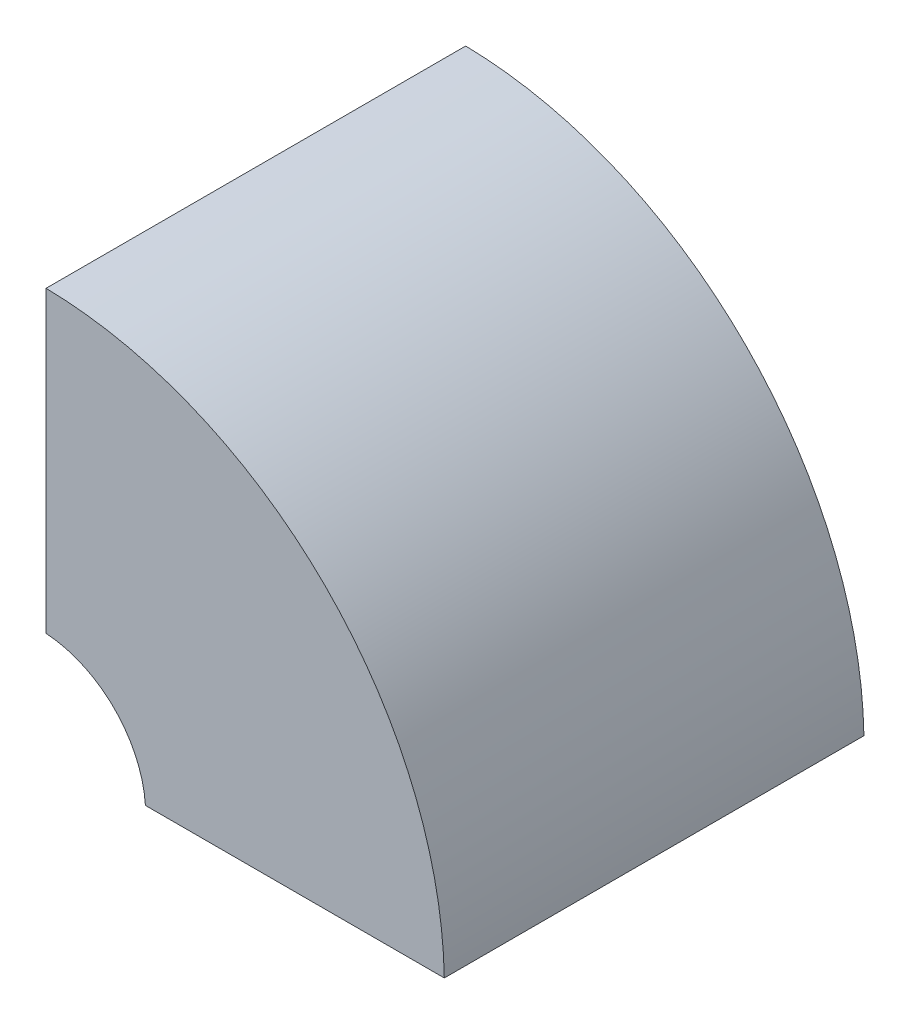
ISO-10303-21;
HEADER;
FILE_DESCRIPTION(('STEP AP214'),'2;1');
FILE_NAME('part.step','',(''),(''),'','','');
FILE_SCHEMA(('AUTOMOTIVE_DESIGN { 1 0 10303 214 1 1 1 1 }'));
ENDSEC;
DATA;
#1=APPLICATION_CONTEXT('core data for automotive mechanical design processes');
#2=APPLICATION_PROTOCOL_DEFINITION('international standard','automotive_design',2000,#1);
#3=PRODUCT_CONTEXT('',#1,'mechanical');
#4=PRODUCT('Part','Part','',(#3));
#5=PRODUCT_RELATED_PRODUCT_CATEGORY('part','',(#4));
#6=PRODUCT_DEFINITION_FORMATION('','',#4);
#7=PRODUCT_DEFINITION_CONTEXT('part definition',#1,'design');
#8=PRODUCT_DEFINITION('design','',#6,#7);
#9=PRODUCT_DEFINITION_SHAPE('','',#8);
#10=(LENGTH_UNIT() NAMED_UNIT(*) SI_UNIT(.MILLI.,.METRE.));
#11=(NAMED_UNIT(*) PLANE_ANGLE_UNIT() SI_UNIT($,.RADIAN.));
#12=(NAMED_UNIT(*) SI_UNIT($,.STERADIAN.) SOLID_ANGLE_UNIT());
#13=UNCERTAINTY_MEASURE_WITH_UNIT(LENGTH_MEASURE(1.E-05),#10,'distance_accuracy_value','');
#14=(GEOMETRIC_REPRESENTATION_CONTEXT(3) GLOBAL_UNCERTAINTY_ASSIGNED_CONTEXT((#13)) GLOBAL_UNIT_ASSIGNED_CONTEXT((#10,
#11,#12)) REPRESENTATION_CONTEXT('',''));
#15=CARTESIAN_POINT('',(0.,0.,0.));
#16=DIRECTION('',(0.,0.,1.));
#17=DIRECTION('',(1.,0.,0.));
#18=AXIS2_PLACEMENT_3D('',#15,#16,#17);
#19=CARTESIAN_POINT('',(0.,0.,-29.5));
#20=DIRECTION('',(0.,0.,-1.));
#21=DIRECTION('',(0.,-1.,0.));
#22=AXIS2_PLACEMENT_3D('',#19,#20,#21);
#23=PLANE('',#22);
#24=CARTESIAN_POINT('',(0.,0.,-29.5));
#25=DIRECTION('',(0.,0.,-1.));
#26=DIRECTION('',(-1.,0.,0.));
#27=AXIS2_PLACEMENT_3D('',#24,#25,#26);
#28=CIRCLE('',#27,28.5);
#29=CARTESIAN_POINT('',(28.49561369755,0.500000000000029,-29.5));
#30=VERTEX_POINT('',#29);
#31=CARTESIAN_POINT('',(0.499999999999992,28.4956136975501,-29.5));
#32=VERTEX_POINT('',#31);
#33=EDGE_CURVE('E45',#30,#32,#28,.F.);
#34=ORIENTED_EDGE('',*,*,#33,.F.);
#35=DIRECTION('',(1.,0.,0.));
#36=VECTOR('',#35,1.);
#37=CARTESIAN_POINT('',(7.48331477354788,0.500000000000028,-29.5));
#38=LINE('',#37,#36);
#39=CARTESIAN_POINT('',(7.48331477354788,0.500000000000029,-29.5));
#40=VERTEX_POINT('',#39);
#41=EDGE_CURVE('E68',#40,#30,#38,.T.);
#42=ORIENTED_EDGE('',*,*,#41,.F.);
#43=CARTESIAN_POINT('',(0.,0.,-29.5));
#44=DIRECTION('',(0.,0.,-1.));
#45=DIRECTION('',(-1.,0.,0.));
#46=AXIS2_PLACEMENT_3D('',#43,#44,#45);
#47=CIRCLE('',#46,7.5);
#48=CARTESIAN_POINT('',(0.499999999999973,7.48331477354788,-29.5));
#49=VERTEX_POINT('',#48);
#50=EDGE_CURVE('E73',#49,#40,#47,.T.);
#51=ORIENTED_EDGE('',*,*,#50,.F.);
#52=DIRECTION('',(0.,-1.,0.));
#53=VECTOR('',#52,1.);
#54=CARTESIAN_POINT('',(0.499999999999992,28.4956136975501,-29.5));
#55=LINE('',#54,#53);
#56=EDGE_CURVE('E88',#32,#49,#55,.T.);
#57=ORIENTED_EDGE('',*,*,#56,.F.);
#58=EDGE_LOOP('',(#34,#42,#51,#57));
#59=FACE_BOUND('',#58,.T.);
#60=ADVANCED_FACE('F37',(#59),#23,.T.);
#61=CARTESIAN_POINT('',(0.,0.,0.));
#62=DIRECTION('',(0.,0.,1.));
#63=DIRECTION('',(1.,0.,0.));
#64=AXIS2_PLACEMENT_3D('',#61,#62,#63);
#65=PLANE('',#64);
#66=CARTESIAN_POINT('',(0.,0.,0.));
#67=DIRECTION('',(0.,0.,1.));
#68=DIRECTION('',(1.,0.,0.));
#69=AXIS2_PLACEMENT_3D('',#66,#67,#68);
#70=CIRCLE('',#69,28.5);
#71=CARTESIAN_POINT('',(28.49561369755,0.500000000000029,0.));
#72=VERTEX_POINT('',#71);
#73=CARTESIAN_POINT('',(0.499999999999992,28.4956136975501,0.));
#74=VERTEX_POINT('',#73);
#75=EDGE_CURVE('E97',#72,#74,#70,.T.);
#76=ORIENTED_EDGE('',*,*,#75,.T.);
#77=DIRECTION('',(0.,-1.,0.));
#78=VECTOR('',#77,1.);
#79=CARTESIAN_POINT('',(0.499999999999992,28.4956136975501,0.));
#80=LINE('',#79,#78);
#81=CARTESIAN_POINT('',(0.499999999999973,7.48331477354788,0.));
#82=VERTEX_POINT('',#81);
#83=EDGE_CURVE('E86',#74,#82,#80,.T.);
#84=ORIENTED_EDGE('',*,*,#83,.T.);
#85=CARTESIAN_POINT('',(0.,0.,0.));
#86=DIRECTION('',(0.,0.,-1.));
#87=DIRECTION('',(1.,0.,0.));
#88=AXIS2_PLACEMENT_3D('',#85,#86,#87);
#89=CIRCLE('',#88,7.5);
#90=CARTESIAN_POINT('',(7.48331477354788,0.500000000000028,0.));
#91=VERTEX_POINT('',#90);
#92=EDGE_CURVE('E89',#82,#91,#89,.T.);
#93=ORIENTED_EDGE('',*,*,#92,.T.);
#94=DIRECTION('',(1.,0.,0.));
#95=VECTOR('',#94,1.);
#96=CARTESIAN_POINT('',(7.48331477354788,0.500000000000028,0.));
#97=LINE('',#96,#95);
#98=EDGE_CURVE('E94',#91,#72,#97,.T.);
#99=ORIENTED_EDGE('',*,*,#98,.T.);
#100=EDGE_LOOP('',(#76,#84,#93,#99));
#101=FACE_BOUND('',#100,.T.);
#102=ADVANCED_FACE('F96',(#101),#65,.T.);
#103=CARTESIAN_POINT('',(0.499999999999992,28.4956136975501,-69.0917765780332));
#104=DIRECTION('',(-1.,0.,0.));
#105=DIRECTION('',(0.,-1.,0.));
#106=AXIS2_PLACEMENT_3D('',#103,#104,#105);
#107=PLANE('',#106);
#108=DIRECTION('',(0.,0.,1.));
#109=VECTOR('',#108,1.);
#110=CARTESIAN_POINT('',(0.499999999999992,28.4956136975501,-69.0917765780332));
#111=LINE('',#110,#109);
#112=EDGE_CURVE('E11',#32,#74,#111,.T.);
#113=ORIENTED_EDGE('',*,*,#112,.F.);
#114=ORIENTED_EDGE('',*,*,#56,.T.);
#115=DIRECTION('',(0.,0.,1.));
#116=VECTOR('',#115,1.);
#117=CARTESIAN_POINT('',(0.499999999999973,7.48331477354788,-69.0917765780332));
#118=LINE('',#117,#116);
#119=EDGE_CURVE('E83',#49,#82,#118,.T.);
#120=ORIENTED_EDGE('',*,*,#119,.T.);
#121=ORIENTED_EDGE('',*,*,#83,.F.);
#122=EDGE_LOOP('',(#113,#114,#120,#121));
#123=FACE_BOUND('',#122,.T.);
#124=ADVANCED_FACE('F84',(#123),#107,.T.);
#125=CARTESIAN_POINT('',(0.,0.,-69.0917765780332));
#126=DIRECTION('',(0.,0.,1.));
#127=DIRECTION('',(1.,0.,0.));
#128=AXIS2_PLACEMENT_3D('',#125,#126,#127);
#129=CYLINDRICAL_SURFACE('',#128,7.5);
#130=ORIENTED_EDGE('',*,*,#119,.F.);
#131=ORIENTED_EDGE('',*,*,#50,.T.);
#132=DIRECTION('',(0.,0.,1.));
#133=VECTOR('',#132,1.);
#134=CARTESIAN_POINT('',(7.48331477354788,0.500000000000028,-69.0917765780332));
#135=LINE('',#134,#133);
#136=EDGE_CURVE('E78',#40,#91,#135,.T.);
#137=ORIENTED_EDGE('',*,*,#136,.T.);
#138=ORIENTED_EDGE('',*,*,#92,.F.);
#139=EDGE_LOOP('',(#130,#131,#137,#138));
#140=FACE_BOUND('',#139,.T.);
#141=ADVANCED_FACE('F90',(#140),#129,.F.);
#142=CARTESIAN_POINT('',(7.48331477354788,0.500000000000028,-69.0917765780332));
#143=DIRECTION('',(0.,-1.,0.));
#144=DIRECTION('',(1.,0.,0.));
#145=AXIS2_PLACEMENT_3D('',#142,#143,#144);
#146=PLANE('',#145);
#147=ORIENTED_EDGE('',*,*,#136,.F.);
#148=ORIENTED_EDGE('',*,*,#41,.T.);
#149=DIRECTION('',(0.,0.,1.));
#150=VECTOR('',#149,1.);
#151=CARTESIAN_POINT('',(28.49561369755,0.500000000000029,-69.0917765780332));
#152=LINE('',#151,#150);
#153=EDGE_CURVE('E104',#30,#72,#152,.T.);
#154=ORIENTED_EDGE('',*,*,#153,.T.);
#155=ORIENTED_EDGE('',*,*,#98,.F.);
#156=EDGE_LOOP('',(#147,#148,#154,#155));
#157=FACE_BOUND('',#156,.T.);
#158=ADVANCED_FACE('F110',(#157),#146,.T.);
#159=CARTESIAN_POINT('',(0.,0.,-69.0917765780332));
#160=DIRECTION('',(0.,0.,1.));
#161=DIRECTION('',(1.,0.,0.));
#162=AXIS2_PLACEMENT_3D('',#159,#160,#161);
#163=CYLINDRICAL_SURFACE('',#162,28.5);
#164=ORIENTED_EDGE('',*,*,#153,.F.);
#165=ORIENTED_EDGE('',*,*,#33,.T.);
#166=ORIENTED_EDGE('',*,*,#112,.T.);
#167=ORIENTED_EDGE('',*,*,#75,.F.);
#168=EDGE_LOOP('',(#164,#165,#166,#167));
#169=FACE_BOUND('',#168,.T.);
#170=ADVANCED_FACE('F111',(#169),#163,.T.);
#171=CLOSED_SHELL('',(#60,#102,#124,#141,#158,#170));
#172=MANIFOLD_SOLID_BREP('B2',#171);
#173=ADVANCED_BREP_SHAPE_REPRESENTATION('',(#18,#172),#14);
#174=SHAPE_DEFINITION_REPRESENTATION(#9,#173);
ENDSEC;
END-ISO-10303-21;
